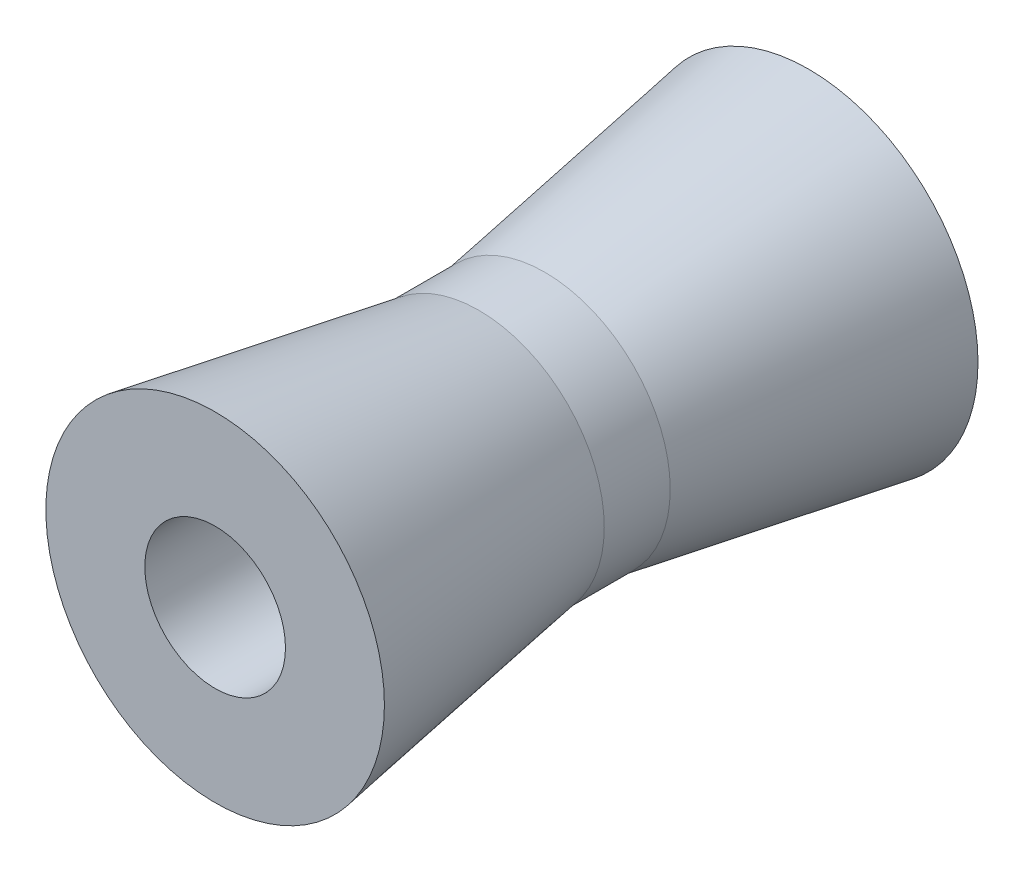
ISO-10303-21;
HEADER;
FILE_DESCRIPTION(('STEP AP214'),'2;1');
FILE_NAME('part.step','',(''),(''),'','','');
FILE_SCHEMA(('AUTOMOTIVE_DESIGN { 1 0 10303 214 1 1 1 1 }'));
ENDSEC;
DATA;
#1=APPLICATION_CONTEXT('core data for automotive mechanical design processes');
#2=APPLICATION_PROTOCOL_DEFINITION('international standard','automotive_design',2000,#1);
#3=PRODUCT_CONTEXT('',#1,'mechanical');
#4=PRODUCT('Part','Part','',(#3));
#5=PRODUCT_RELATED_PRODUCT_CATEGORY('part','',(#4));
#6=PRODUCT_DEFINITION_FORMATION('','',#4);
#7=PRODUCT_DEFINITION_CONTEXT('part definition',#1,'design');
#8=PRODUCT_DEFINITION('design','',#6,#7);
#9=PRODUCT_DEFINITION_SHAPE('','',#8);
#10=(LENGTH_UNIT() NAMED_UNIT(*) SI_UNIT(.MILLI.,.METRE.));
#11=(NAMED_UNIT(*) PLANE_ANGLE_UNIT() SI_UNIT($,.RADIAN.));
#12=(NAMED_UNIT(*) SI_UNIT($,.STERADIAN.) SOLID_ANGLE_UNIT());
#13=UNCERTAINTY_MEASURE_WITH_UNIT(LENGTH_MEASURE(1.E-05),#10,'distance_accuracy_value','');
#14=(GEOMETRIC_REPRESENTATION_CONTEXT(3) GLOBAL_UNCERTAINTY_ASSIGNED_CONTEXT((#13)) GLOBAL_UNIT_ASSIGNED_CONTEXT((#10,
#11,#12)) REPRESENTATION_CONTEXT('',''));
#15=CARTESIAN_POINT('',(0.,0.,0.));
#16=DIRECTION('',(0.,0.,1.));
#17=DIRECTION('',(1.,0.,0.));
#18=AXIS2_PLACEMENT_3D('',#15,#16,#17);
#19=CARTESIAN_POINT('',(0.,0.,8.5725));
#20=DIRECTION('',(0.,0.,-1.));
#21=DIRECTION('',(-1.,0.,0.));
#22=AXIS2_PLACEMENT_3D('',#19,#20,#21);
#23=CYLINDRICAL_SURFACE('',#22,3.6195);
#24=CARTESIAN_POINT('',(0.,0.,-0.952499999999997));
#25=DIRECTION('',(0.,0.,-1.));
#26=DIRECTION('',(-1.,0.,0.));
#27=AXIS2_PLACEMENT_3D('',#24,#25,#26);
#28=CIRCLE('',#27,3.6195);
#29=CARTESIAN_POINT('',(-3.6195,0.,-0.952499999999997));
#30=VERTEX_POINT('',#29);
#31=EDGE_CURVE('E40',#30,#30,#28,.T.);
#32=ORIENTED_EDGE('',*,*,#31,.F.);
#33=EDGE_LOOP('',(#32));
#34=FACE_BOUND('',#33,.T.);
#35=CARTESIAN_POINT('',(0.,0.,0.952499999999997));
#36=DIRECTION('',(0.,0.,1.));
#37=DIRECTION('',(1.,0.,0.));
#38=AXIS2_PLACEMENT_3D('',#35,#36,#37);
#39=CIRCLE('',#38,3.6195);
#40=CARTESIAN_POINT('',(3.6195,0.,0.952499999999997));
#41=VERTEX_POINT('',#40);
#42=EDGE_CURVE('E10',#41,#41,#39,.T.);
#43=ORIENTED_EDGE('',*,*,#42,.F.);
#44=EDGE_LOOP('',(#43));
#45=FACE_BOUND('',#44,.T.);
#46=ADVANCED_FACE('F34',(#34,#45),#23,.T.);
#47=CARTESIAN_POINT('',(0.,0.,8.5725));
#48=DIRECTION('',(0.,0.,1.));
#49=DIRECTION('',(1.,0.,0.));
#50=AXIS2_PLACEMENT_3D('',#47,#48,#49);
#51=PLANE('',#50);
#52=CARTESIAN_POINT('',(0.,0.,8.5725));
#53=DIRECTION('',(0.,0.,1.));
#54=DIRECTION('',(1.,0.,0.));
#55=AXIS2_PLACEMENT_3D('',#52,#53,#54);
#56=CIRCLE('',#55,2.032);
#57=CARTESIAN_POINT('',(2.032,0.,8.5725));
#58=VERTEX_POINT('',#57);
#59=EDGE_CURVE('E44',#58,#58,#56,.T.);
#60=ORIENTED_EDGE('',*,*,#59,.F.);
#61=EDGE_LOOP('',(#60));
#62=FACE_BOUND('',#61,.T.);
#63=CARTESIAN_POINT('',(0.,0.,8.5725));
#64=DIRECTION('',(0.,0.,1.));
#65=DIRECTION('',(1.,0.,0.));
#66=AXIS2_PLACEMENT_3D('',#63,#64,#65);
#67=CIRCLE('',#66,4.8895);
#68=CARTESIAN_POINT('',(4.8895,0.,8.5725));
#69=VERTEX_POINT('',#68);
#70=EDGE_CURVE('E56',#69,#69,#67,.T.);
#71=ORIENTED_EDGE('',*,*,#70,.T.);
#72=EDGE_LOOP('',(#71));
#73=FACE_BOUND('',#72,.T.);
#74=ADVANCED_FACE('F60',(#62,#73),#51,.T.);
#75=CARTESIAN_POINT('',(0.,0.,-8.5725));
#76=DIRECTION('',(0.,0.,1.));
#77=DIRECTION('',(1.,0.,0.));
#78=AXIS2_PLACEMENT_3D('',#75,#76,#77);
#79=PLANE('',#78);
#80=CARTESIAN_POINT('',(0.,0.,-8.5725));
#81=DIRECTION('',(0.,0.,1.));
#82=DIRECTION('',(1.,0.,0.));
#83=AXIS2_PLACEMENT_3D('',#80,#81,#82);
#84=CIRCLE('',#83,2.032);
#85=CARTESIAN_POINT('',(2.032,0.,-8.5725));
#86=VERTEX_POINT('',#85);
#87=EDGE_CURVE('E48',#86,#86,#84,.T.);
#88=ORIENTED_EDGE('',*,*,#87,.T.);
#89=EDGE_LOOP('',(#88));
#90=FACE_BOUND('',#89,.T.);
#91=CARTESIAN_POINT('',(0.,0.,-8.5725));
#92=DIRECTION('',(0.,0.,1.));
#93=DIRECTION('',(1.,0.,0.));
#94=AXIS2_PLACEMENT_3D('',#91,#92,#93);
#95=CIRCLE('',#94,4.8895);
#96=CARTESIAN_POINT('',(4.8895,0.,-8.5725));
#97=VERTEX_POINT('',#96);
#98=EDGE_CURVE('E52',#97,#97,#95,.T.);
#99=ORIENTED_EDGE('',*,*,#98,.F.);
#100=EDGE_LOOP('',(#99));
#101=FACE_BOUND('',#100,.T.);
#102=ADVANCED_FACE('F76',(#90,#101),#79,.F.);
#103=CARTESIAN_POINT('',(0.,0.,8.5725));
#104=DIRECTION('',(0.,0.,-1.));
#105=DIRECTION('',(-1.,0.,0.));
#106=AXIS2_PLACEMENT_3D('',#103,#104,#105);
#107=CYLINDRICAL_SURFACE('',#106,2.032);
#108=ORIENTED_EDGE('',*,*,#59,.T.);
#109=EDGE_LOOP('',(#108));
#110=FACE_BOUND('',#109,.T.);
#111=ORIENTED_EDGE('',*,*,#87,.F.);
#112=EDGE_LOOP('',(#111));
#113=FACE_BOUND('',#112,.T.);
#114=ADVANCED_FACE('F69',(#110,#113),#107,.F.);
#115=CARTESIAN_POINT('',(0.,0.,-8.5725));
#116=DIRECTION('',(0.,0.,-1.));
#117=DIRECTION('',(-1.,0.,0.));
#118=AXIS2_PLACEMENT_3D('',#115,#116,#117);
#119=CONICAL_SURFACE('',#118,4.8895,0.165148677414627);
#120=ORIENTED_EDGE('',*,*,#31,.T.);
#121=EDGE_LOOP('',(#120));
#122=FACE_BOUND('',#121,.T.);
#123=ORIENTED_EDGE('',*,*,#98,.T.);
#124=EDGE_LOOP('',(#123));
#125=FACE_BOUND('',#124,.T.);
#126=ADVANCED_FACE('F64',(#122,#125),#119,.T.);
#127=CARTESIAN_POINT('',(0.,0.,8.5725));
#128=DIRECTION('',(0.,0.,1.));
#129=DIRECTION('',(-1.,0.,0.));
#130=AXIS2_PLACEMENT_3D('',#127,#128,#129);
#131=CONICAL_SURFACE('',#130,4.8895,0.165148677414627);
#132=ORIENTED_EDGE('',*,*,#42,.T.);
#133=EDGE_LOOP('',(#132));
#134=FACE_BOUND('',#133,.T.);
#135=ORIENTED_EDGE('',*,*,#70,.F.);
#136=EDGE_LOOP('',(#135));
#137=FACE_BOUND('',#136,.T.);
#138=ADVANCED_FACE('F62',(#134,#137),#131,.T.);
#139=CLOSED_SHELL('',(#46,#74,#102,#114,#126,#138));
#140=MANIFOLD_SOLID_BREP('B2',#139);
#141=ADVANCED_BREP_SHAPE_REPRESENTATION('',(#18,#140),#14);
#142=SHAPE_DEFINITION_REPRESENTATION(#9,#141);
ENDSEC;
END-ISO-10303-21;
